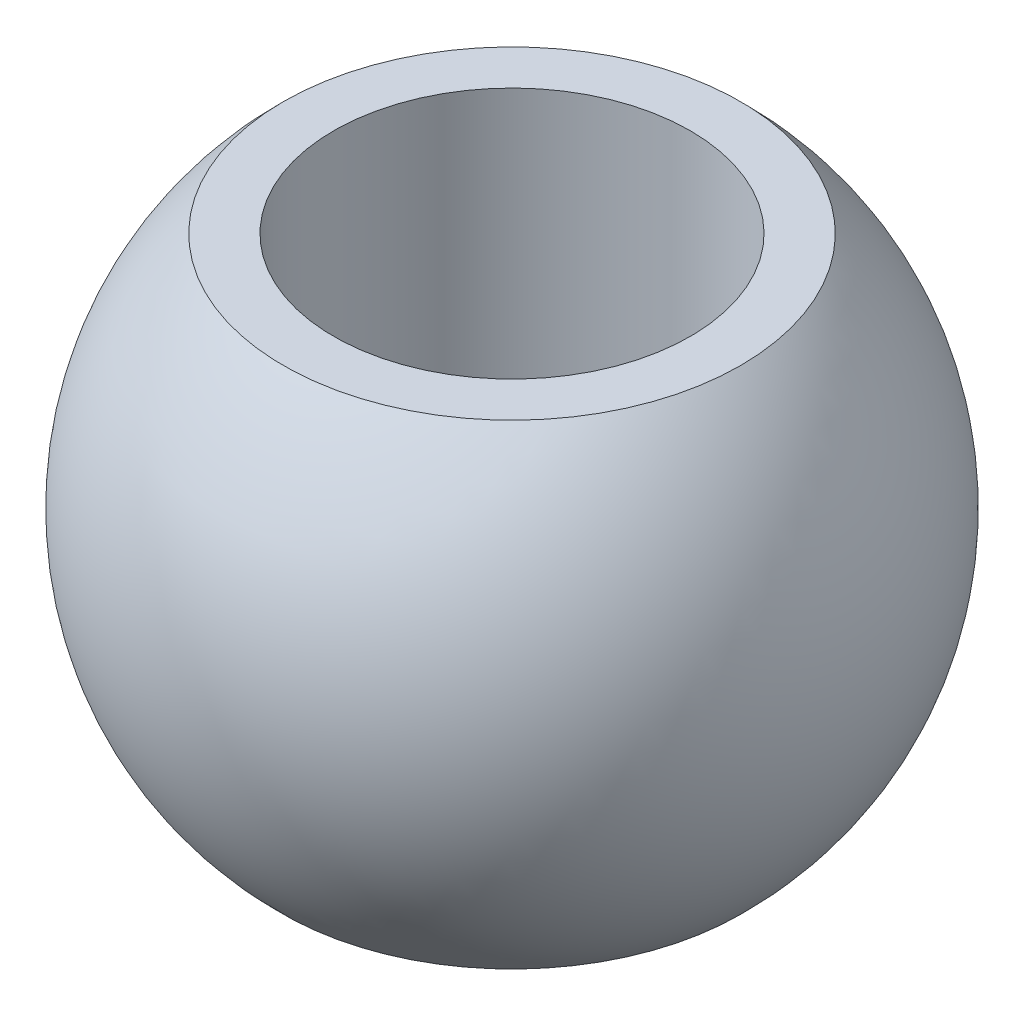
ISO-10303-21;
HEADER;
FILE_DESCRIPTION(('STEP AP214'),'2;1');
FILE_NAME('part.step','',(''),(''),'','','');
FILE_SCHEMA(('AUTOMOTIVE_DESIGN { 1 0 10303 214 1 1 1 1 }'));
ENDSEC;
DATA;
#1=APPLICATION_CONTEXT('core data for automotive mechanical design processes');
#2=APPLICATION_PROTOCOL_DEFINITION('international standard','automotive_design',2000,#1);
#3=PRODUCT_CONTEXT('',#1,'mechanical');
#4=PRODUCT('Part','Part','',(#3));
#5=PRODUCT_RELATED_PRODUCT_CATEGORY('part','',(#4));
#6=PRODUCT_DEFINITION_FORMATION('','',#4);
#7=PRODUCT_DEFINITION_CONTEXT('part definition',#1,'design');
#8=PRODUCT_DEFINITION('design','',#6,#7);
#9=PRODUCT_DEFINITION_SHAPE('','',#8);
#10=(LENGTH_UNIT() NAMED_UNIT(*) SI_UNIT(.MILLI.,.METRE.));
#11=(NAMED_UNIT(*) PLANE_ANGLE_UNIT() SI_UNIT($,.RADIAN.));
#12=(NAMED_UNIT(*) SI_UNIT($,.STERADIAN.) SOLID_ANGLE_UNIT());
#13=UNCERTAINTY_MEASURE_WITH_UNIT(LENGTH_MEASURE(1.E-05),#10,'distance_accuracy_value','');
#14=(GEOMETRIC_REPRESENTATION_CONTEXT(3) GLOBAL_UNCERTAINTY_ASSIGNED_CONTEXT((#13)) GLOBAL_UNIT_ASSIGNED_CONTEXT((#10,
#11,#12)) REPRESENTATION_CONTEXT('',''));
#15=CARTESIAN_POINT('',(0.,0.,0.));
#16=DIRECTION('',(0.,0.,1.));
#17=DIRECTION('',(1.,0.,0.));
#18=AXIS2_PLACEMENT_3D('',#15,#16,#17);
#19=CARTESIAN_POINT('',(6.,-8.,0.));
#20=DIRECTION('',(0.,-1.,0.));
#21=DIRECTION('',(0.,0.,-1.));
#22=AXIS2_PLACEMENT_3D('',#19,#20,#21);
#23=PLANE('',#22);
#24=CARTESIAN_POINT('',(0.,-8.,0.));
#25=DIRECTION('',(0.,-1.,0.));
#26=DIRECTION('',(0.,0.,-1.));
#27=AXIS2_PLACEMENT_3D('',#24,#25,#26);
#28=CIRCLE('',#27,7.69480344128425);
#29=CARTESIAN_POINT('',(7.69480344128425,-8.,0.));
#30=VERTEX_POINT('',#29);
#31=EDGE_CURVE('E10',#30,#30,#28,.T.);
#32=ORIENTED_EDGE('',*,*,#31,.T.);
#33=EDGE_LOOP('',(#32));
#34=FACE_BOUND('',#33,.T.);
#35=CARTESIAN_POINT('',(0.,-8.,0.));
#36=DIRECTION('',(0.,-1.,0.));
#37=DIRECTION('',(0.,0.,-1.));
#38=AXIS2_PLACEMENT_3D('',#35,#36,#37);
#39=CIRCLE('',#38,6.);
#40=CARTESIAN_POINT('',(0.,-8.,-6.));
#41=VERTEX_POINT('',#40);
#42=EDGE_CURVE('E45',#41,#41,#39,.T.);
#43=ORIENTED_EDGE('',*,*,#42,.F.);
#44=EDGE_LOOP('',(#43));
#45=FACE_BOUND('',#44,.T.);
#46=ADVANCED_FACE('F31',(#34,#45),#23,.T.);
#47=CARTESIAN_POINT('',(0.,0.,0.));
#48=DIRECTION('',(0.,-1.,0.));
#49=DIRECTION('',(1.,0.,0.));
#50=AXIS2_PLACEMENT_3D('',#47,#48,#49);
#51=SPHERICAL_SURFACE('',#50,11.1);
#52=CARTESIAN_POINT('',(0.,8.,0.));
#53=DIRECTION('',(0.,-1.,0.));
#54=DIRECTION('',(0.,0.,-1.));
#55=AXIS2_PLACEMENT_3D('',#52,#53,#54);
#56=CIRCLE('',#55,7.69480344128425);
#57=CARTESIAN_POINT('',(7.69480344128426,8.,0.));
#58=VERTEX_POINT('',#57);
#59=EDGE_CURVE('E37',#58,#58,#56,.T.);
#60=CARTESIAN_POINT('',(7.69480344128426,8.,0.));
#61=CARTESIAN_POINT('',(7.82894677247175,7.87098007376294,0.));
#62=CARTESIAN_POINT('',(7.95983895980759,7.73858058897692,0.));
#63=CARTESIAN_POINT('',(8.21480352042311,7.46737024077116,0.));
#64=CARTESIAN_POINT('',(8.33887589370279,7.3285593773514,0.));
#65=CARTESIAN_POINT('',(8.57988329985309,7.04487401034232,0.));
#66=CARTESIAN_POINT('',(8.69681833272372,6.89999950675299,0.));
#67=CARTESIAN_POINT('',(8.92325621076317,6.60455428380098,0.));
#68=CARTESIAN_POINT('',(9.032759055932,6.4539835644383,0.));
#69=CARTESIAN_POINT('',(9.24405527464821,6.14752658020301,0.));
#70=CARTESIAN_POINT('',(9.34584864819561,5.9916403153304,0.));
#71=CARTESIAN_POINT('',(9.54146847521012,5.67494666972675,0.));
#72=CARTESIAN_POINT('',(9.63529492867723,5.51413928899571,0.));
#73=CARTESIAN_POINT('',(9.81474353298685,5.18801020724045,0.));
#74=CARTESIAN_POINT('',(9.90036568382936,5.02268850621623,0.));
#75=CARTESIAN_POINT('',(10.0631890795591,4.68794902224653,0.));
#76=CARTESIAN_POINT('',(10.1403903244464,4.51853123930107,0.));
#77=CARTESIAN_POINT('',(10.2861766019001,4.1760281861954,0.));
#78=CARTESIAN_POINT('',(10.3547616344666,4.00294291603521,0.));
#79=CARTESIAN_POINT('',(10.4831419800641,3.65354276288628,0.));
#80=CARTESIAN_POINT('',(10.5429372930951,3.47722787989755,0.));
#81=CARTESIAN_POINT('',(10.6535869283296,3.12181454537596,0.));
#82=CARTESIAN_POINT('',(10.7044412505331,2.94271609384311,0.));
#83=CARTESIAN_POINT('',(10.7970802520135,2.58218870855201,0.));
#84=CARTESIAN_POINT('',(10.8388649312904,2.40075977479376,0.));
#85=CARTESIAN_POINT('',(10.9132589393216,2.03603040703301,0.));
#86=CARTESIAN_POINT('',(10.9458682680759,1.85272997303052,0.));
#87=CARTESIAN_POINT('',(11.0018290794321,1.48472132132372,0.));
#88=CARTESIAN_POINT('',(11.025180562034,1.30001310361943,0.));
#89=CARTESIAN_POINT('',(11.0625666061087,0.929656162484296,0.));
#90=CARTESIAN_POINT('',(11.0766011675815,0.744007439053462,0.));
#91=CARTESIAN_POINT('',(11.0953178645272,0.372239143748418,0.));
#92=CARTESIAN_POINT('',(11.1,0.186119571874209,0.));
#93=CARTESIAN_POINT('',(11.1,-0.186119571874211,0.));
#94=CARTESIAN_POINT('',(11.0953178645272,-0.372239143748421,0.));
#95=CARTESIAN_POINT('',(11.0766011675815,-0.744007439053465,0.));
#96=CARTESIAN_POINT('',(11.0625666061087,-0.929656162484299,0.));
#97=CARTESIAN_POINT('',(11.025180562034,-1.30001310361943,0.));
#98=CARTESIAN_POINT('',(11.0018290794321,-1.48472132132373,0.));
#99=CARTESIAN_POINT('',(10.9458682680759,-1.85272997303052,0.));
#100=CARTESIAN_POINT('',(10.9132589393216,-2.03603040703301,0.));
#101=CARTESIAN_POINT('',(10.8388649312903,-2.40075977479376,0.));
#102=CARTESIAN_POINT('',(10.7970802520135,-2.58218870855201,0.));
#103=CARTESIAN_POINT('',(10.7044412505331,-2.94271609384312,0.));
#104=CARTESIAN_POINT('',(10.6535869283296,-3.12181454537597,0.));
#105=CARTESIAN_POINT('',(10.5429372930951,-3.47722787989755,0.));
#106=CARTESIAN_POINT('',(10.4831419800641,-3.65354276288628,0.));
#107=CARTESIAN_POINT('',(10.3547616344666,-4.00294291603521,0.));
#108=CARTESIAN_POINT('',(10.2861766019001,-4.17602818619541,0.));
#109=CARTESIAN_POINT('',(10.1403903244464,-4.51853123930107,0.));
#110=CARTESIAN_POINT('',(10.0631890795591,-4.68794902224654,0.));
#111=CARTESIAN_POINT('',(9.90036568382936,-5.02268850621623,0.));
#112=CARTESIAN_POINT('',(9.81474353298685,-5.18801020724046,0.));
#113=CARTESIAN_POINT('',(9.63529492867723,-5.51413928899572,0.));
#114=CARTESIAN_POINT('',(9.54146847521011,-5.67494666972675,0.));
#115=CARTESIAN_POINT('',(9.34584864819561,-5.9916403153304,0.));
#116=CARTESIAN_POINT('',(9.24405527464821,-6.14752658020301,0.));
#117=CARTESIAN_POINT('',(9.03275905593199,-6.4539835644383,0.));
#118=CARTESIAN_POINT('',(8.92325621076317,-6.60455428380098,0.));
#119=CARTESIAN_POINT('',(8.69681833272372,-6.89999950675299,0.));
#120=CARTESIAN_POINT('',(8.57988329985309,-7.04487401034232,0.));
#121=CARTESIAN_POINT('',(8.33887589370279,-7.3285593773514,0.));
#122=CARTESIAN_POINT('',(8.21480352042311,-7.46737024077116,0.));
#123=CARTESIAN_POINT('',(7.95983895980759,-7.73858058897693,0.));
#124=CARTESIAN_POINT('',(7.82894677247175,-7.87098007376294,0.));
#125=CARTESIAN_POINT('',(7.69480344128425,-8.,0.));
#126=B_SPLINE_CURVE_WITH_KNOTS('',3,(#60,#61,#62,#63,#64,#65,#66,#67,#68,#69,#70,#71,#72,#73,
#74,#75,#76,#77,#78,#79,#80,#81,#82,#83,#84,#85,#86,#87,#88,#89,#90,#91,#92,#93,#94,#95,#96,#97,
#98,#99,#100,#101,#102,#103,#104,#105,#106,#107,#108,#109,#110,#111,#112,#113,#114,#115,#116,
#117,#118,#119,#120,#121,#122,#123,#124,#125),.UNSPECIFIED.,.F.,.F.,(4,2,2,2,2,2,2,2,2,2,2,2,2,
2,2,2,2,2,2,2,2,2,2,2,2,2,2,2,2,2,2,2,4),(0.,0.558299868881991,1.11659973776398,
1.67489960664597,2.23319947552796,2.79149934440996,3.34979921329195,3.90809908217394,
4.46639895105593,5.02469881993792,5.58299868881991,6.1412985577019,6.6995984265839,
7.25789829546589,7.81619816434788,8.37449803322987,8.93279790211186,9.49109777099385,
10.0493976398758,10.6076975087578,11.1659973776398,11.7242972465218,12.2825971154038,
12.8408969842858,13.3991968531678,13.9574967220498,14.5157965909318,15.0740964598138,
15.6323963286957,16.1906961975777,16.7489960664597,17.3072959353417,17.8655958042237),.UNSPECIFIED.);
#127=EDGE_CURVE('BSEAM55',#58,#30,#126,.T.);
#128=ORIENTED_EDGE('',*,*,#59,.T.);
#129=ORIENTED_EDGE('',*,*,#31,.F.);
#130=ORIENTED_EDGE('',*,*,#127,.T.);
#131=ORIENTED_EDGE('',*,*,#127,.F.);
#132=EDGE_LOOP('',(#128,#130,#129,#131));
#133=FACE_BOUND('',#132,.T.);
#134=ADVANCED_FACE('F55',(#133),#51,.T.);
#135=CARTESIAN_POINT('',(6.,8.,0.));
#136=DIRECTION('',(0.,1.,0.));
#137=DIRECTION('',(0.,0.,1.));
#138=AXIS2_PLACEMENT_3D('',#135,#136,#137);
#139=PLANE('',#138);
#140=CARTESIAN_POINT('',(0.,8.,0.));
#141=DIRECTION('',(0.,-1.,0.));
#142=DIRECTION('',(0.,0.,-1.));
#143=AXIS2_PLACEMENT_3D('',#140,#141,#142);
#144=CIRCLE('',#143,6.);
#145=CARTESIAN_POINT('',(0.,8.,-6.));
#146=VERTEX_POINT('',#145);
#147=EDGE_CURVE('E41',#146,#146,#144,.T.);
#148=ORIENTED_EDGE('',*,*,#147,.T.);
#149=EDGE_LOOP('',(#148));
#150=FACE_BOUND('',#149,.T.);
#151=ORIENTED_EDGE('',*,*,#59,.F.);
#152=EDGE_LOOP('',(#151));
#153=FACE_BOUND('',#152,.T.);
#154=ADVANCED_FACE('F59',(#150,#153),#139,.T.);
#155=CARTESIAN_POINT('',(0.,-11.1,0.));
#156=DIRECTION('',(0.,-1.,0.));
#157=DIRECTION('',(0.,0.,-1.));
#158=AXIS2_PLACEMENT_3D('',#155,#156,#157);
#159=CYLINDRICAL_SURFACE('',#158,6.);
#160=ORIENTED_EDGE('',*,*,#42,.T.);
#161=EDGE_LOOP('',(#160));
#162=FACE_BOUND('',#161,.T.);
#163=ORIENTED_EDGE('',*,*,#147,.F.);
#164=EDGE_LOOP('',(#163));
#165=FACE_BOUND('',#164,.T.);
#166=ADVANCED_FACE('F51',(#162,#165),#159,.F.);
#167=CLOSED_SHELL('',(#46,#134,#154,#166));
#168=MANIFOLD_SOLID_BREP('B2',#167);
#169=ADVANCED_BREP_SHAPE_REPRESENTATION('',(#18,#168),#14);
#170=SHAPE_DEFINITION_REPRESENTATION(#9,#169);
ENDSEC;
END-ISO-10303-21;
